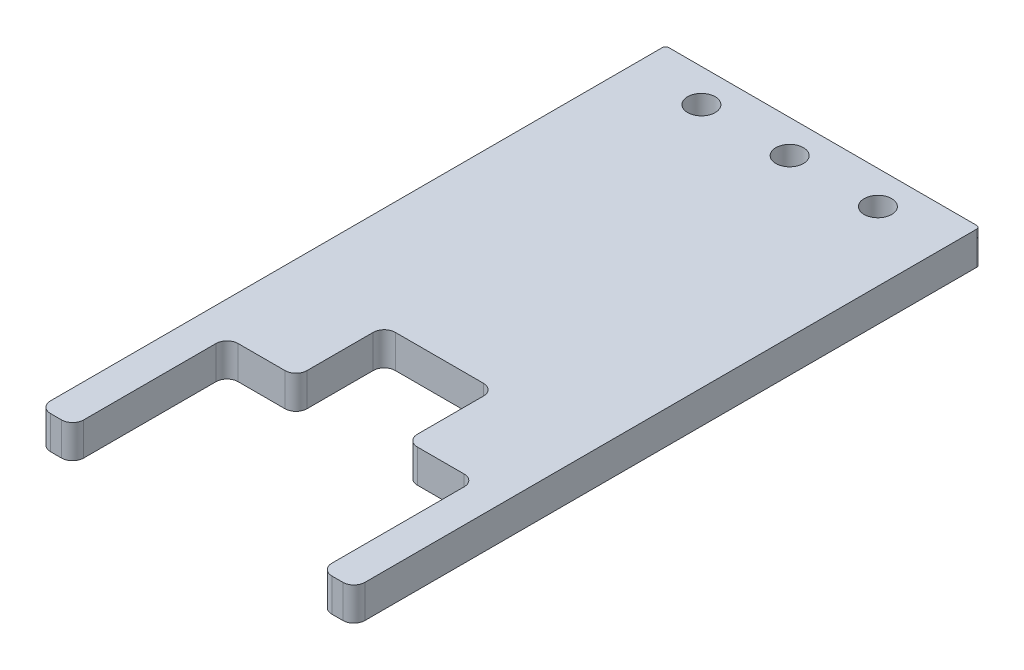
ISO-10303-21;
HEADER;
FILE_DESCRIPTION(('STEP AP214'),'2;1');
FILE_NAME('part.step','',(''),(''),'','','');
FILE_SCHEMA(('AUTOMOTIVE_DESIGN { 1 0 10303 214 1 1 1 1 }'));
ENDSEC;
DATA;
#1=APPLICATION_CONTEXT('core data for automotive mechanical design processes');
#2=APPLICATION_PROTOCOL_DEFINITION('international standard','automotive_design',2000,#1);
#3=PRODUCT_CONTEXT('',#1,'mechanical');
#4=PRODUCT('Part','Part','',(#3));
#5=PRODUCT_RELATED_PRODUCT_CATEGORY('part','',(#4));
#6=PRODUCT_DEFINITION_FORMATION('','',#4);
#7=PRODUCT_DEFINITION_CONTEXT('part definition',#1,'design');
#8=PRODUCT_DEFINITION('design','',#6,#7);
#9=PRODUCT_DEFINITION_SHAPE('','',#8);
#10=(LENGTH_UNIT() NAMED_UNIT(*) SI_UNIT(.MILLI.,.METRE.));
#11=(NAMED_UNIT(*) PLANE_ANGLE_UNIT() SI_UNIT($,.RADIAN.));
#12=(NAMED_UNIT(*) SI_UNIT($,.STERADIAN.) SOLID_ANGLE_UNIT());
#13=UNCERTAINTY_MEASURE_WITH_UNIT(LENGTH_MEASURE(1.E-05),#10,'distance_accuracy_value','');
#14=(GEOMETRIC_REPRESENTATION_CONTEXT(3) GLOBAL_UNCERTAINTY_ASSIGNED_CONTEXT((#13)) GLOBAL_UNIT_ASSIGNED_CONTEXT((#10,
#11,#12)) REPRESENTATION_CONTEXT('',''));
#15=CARTESIAN_POINT('',(0.,0.,0.));
#16=DIRECTION('',(0.,0.,1.));
#17=DIRECTION('',(1.,0.,0.));
#18=AXIS2_PLACEMENT_3D('',#15,#16,#17);
#19=CARTESIAN_POINT('',(0.,3.,0.));
#20=DIRECTION('',(0.,0.,-1.));
#21=DIRECTION('',(-1.,0.,0.));
#22=AXIS2_PLACEMENT_3D('',#19,#20,#21);
#23=PLANE('',#22);
#24=DIRECTION('',(1.,0.,0.));
#25=VECTOR('',#24,1.);
#26=CARTESIAN_POINT('',(0.,3.,0.));
#27=LINE('',#26,#25);
#28=CARTESIAN_POINT('',(20.25,3.,0.));
#29=VERTEX_POINT('',#28);
#30=CARTESIAN_POINT('',(24.5,3.,0.));
#31=VERTEX_POINT('',#30);
#32=EDGE_CURVE('E289',#29,#31,#27,.T.);
#33=ORIENTED_EDGE('',*,*,#32,.F.);
#34=DIRECTION('',(0.,1.,0.));
#35=VECTOR('',#34,1.);
#36=CARTESIAN_POINT('',(20.25,3.,0.));
#37=LINE('',#36,#35);
#38=CARTESIAN_POINT('',(20.25,0.,0.));
#39=VERTEX_POINT('',#38);
#40=EDGE_CURVE('E209',#29,#39,#37,.F.);
#41=ORIENTED_EDGE('',*,*,#40,.T.);
#42=DIRECTION('',(1.,0.,0.));
#43=VECTOR('',#42,1.);
#44=CARTESIAN_POINT('',(0.,0.,0.));
#45=LINE('',#44,#43);
#46=CARTESIAN_POINT('',(24.5,0.,0.));
#47=VERTEX_POINT('',#46);
#48=EDGE_CURVE('E284',#39,#47,#45,.T.);
#49=ORIENTED_EDGE('',*,*,#48,.T.);
#50=DIRECTION('',(0.,1.,0.));
#51=VECTOR('',#50,1.);
#52=CARTESIAN_POINT('',(24.5,3.,0.));
#53=LINE('',#52,#51);
#54=EDGE_CURVE('E213',#47,#31,#53,.T.);
#55=ORIENTED_EDGE('',*,*,#54,.T.);
#56=EDGE_LOOP('',(#33,#41,#49,#55));
#57=FACE_BOUND('',#56,.T.);
#58=ADVANCED_FACE('F40',(#57),#23,.F.);
#59=CARTESIAN_POINT('',(4.,0.,0.));
#60=VERTEX_POINT('',#59);
#61=CARTESIAN_POINT('',(8.25,0.,0.));
#62=VERTEX_POINT('',#61);
#63=EDGE_CURVE('E295',#60,#62,#45,.T.);
#64=ORIENTED_EDGE('',*,*,#63,.T.);
#65=DIRECTION('',(0.,1.,0.));
#66=VECTOR('',#65,1.);
#67=CARTESIAN_POINT('',(8.25,3.,0.));
#68=LINE('',#67,#66);
#69=CARTESIAN_POINT('',(8.25,3.,0.));
#70=VERTEX_POINT('',#69);
#71=EDGE_CURVE('E342',#62,#70,#68,.T.);
#72=ORIENTED_EDGE('',*,*,#71,.T.);
#73=CARTESIAN_POINT('',(4.,3.,0.));
#74=VERTEX_POINT('',#73);
#75=EDGE_CURVE('E285',#74,#70,#27,.T.);
#76=ORIENTED_EDGE('',*,*,#75,.F.);
#77=DIRECTION('',(0.,1.,0.));
#78=VECTOR('',#77,1.);
#79=CARTESIAN_POINT('',(4.,3.,0.));
#80=LINE('',#79,#78);
#81=EDGE_CURVE('E340',#74,#60,#80,.F.);
#82=ORIENTED_EDGE('',*,*,#81,.T.);
#83=EDGE_LOOP('',(#64,#72,#76,#82));
#84=FACE_BOUND('',#83,.T.);
#85=ADVANCED_FACE('F436',(#84),#23,.F.);
#86=CARTESIAN_POINT('',(0.,3.,0.));
#87=DIRECTION('',(0.,1.,0.));
#88=DIRECTION('',(0.,0.,1.));
#89=AXIS2_PLACEMENT_3D('',#86,#87,#88);
#90=PLANE('',#89);
#91=DIRECTION('',(0.,0.,-1.));
#92=VECTOR('',#91,1.);
#93=CARTESIAN_POINT('',(28.5,3.,0.));
#94=LINE('',#93,#92);
#95=CARTESIAN_POINT('',(28.5,3.,13.));
#96=VERTEX_POINT('',#95);
#97=CARTESIAN_POINT('',(28.5,3.,-42.45));
#98=VERTEX_POINT('',#97);
#99=EDGE_CURVE('E288',#96,#98,#94,.T.);
#100=ORIENTED_EDGE('',*,*,#99,.T.);
#101=CARTESIAN_POINT('',(28.2,3.,-42.45));
#102=DIRECTION('',(0.,1.,0.));
#103=DIRECTION('',(0.,0.,1.));
#104=AXIS2_PLACEMENT_3D('',#101,#102,#103);
#105=CIRCLE('',#104,0.3);
#106=CARTESIAN_POINT('',(28.2,3.,-42.75));
#107=VERTEX_POINT('',#106);
#108=EDGE_CURVE('E48',#98,#107,#105,.T.);
#109=ORIENTED_EDGE('',*,*,#108,.T.);
#110=DIRECTION('',(-1.,0.,0.));
#111=VECTOR('',#110,1.);
#112=CARTESIAN_POINT('',(0.,3.,-42.75));
#113=LINE('',#112,#111);
#114=CARTESIAN_POINT('',(0.299999999999999,3.,-42.75));
#115=VERTEX_POINT('',#114);
#116=EDGE_CURVE('E291',#107,#115,#113,.T.);
#117=ORIENTED_EDGE('',*,*,#116,.T.);
#118=CARTESIAN_POINT('',(0.3,3.,-42.45));
#119=DIRECTION('',(0.,1.,0.));
#120=DIRECTION('',(0.,0.,1.));
#121=AXIS2_PLACEMENT_3D('',#118,#119,#120);
#122=CIRCLE('',#121,0.3);
#123=CARTESIAN_POINT('',(0.,3.,-42.45));
#124=VERTEX_POINT('',#123);
#125=EDGE_CURVE('E55',#115,#124,#122,.T.);
#126=ORIENTED_EDGE('',*,*,#125,.T.);
#127=DIRECTION('',(0.,0.,1.));
#128=VECTOR('',#127,1.);
#129=CARTESIAN_POINT('',(0.,3.,-42.75));
#130=LINE('',#129,#128);
#131=CARTESIAN_POINT('',(0.,3.,13.));
#132=VERTEX_POINT('',#131);
#133=EDGE_CURVE('E293',#124,#132,#130,.T.);
#134=ORIENTED_EDGE('',*,*,#133,.T.);
#135=CARTESIAN_POINT('',(1.,3.,13.));
#136=DIRECTION('',(0.,1.,0.));
#137=DIRECTION('',(0.,0.,1.));
#138=AXIS2_PLACEMENT_3D('',#135,#136,#137);
#139=CIRCLE('',#138,1.);
#140=CARTESIAN_POINT('',(1.,3.,14.));
#141=VERTEX_POINT('',#140);
#142=EDGE_CURVE('E311',#132,#141,#139,.T.);
#143=ORIENTED_EDGE('',*,*,#142,.T.);
#144=DIRECTION('',(1.,0.,0.));
#145=VECTOR('',#144,1.);
#146=CARTESIAN_POINT('',(0.,3.,14.));
#147=LINE('',#146,#145);
#148=CARTESIAN_POINT('',(2.,3.,14.));
#149=VERTEX_POINT('',#148);
#150=EDGE_CURVE('E254',#141,#149,#147,.T.);
#151=ORIENTED_EDGE('',*,*,#150,.T.);
#152=CARTESIAN_POINT('',(2.,3.,13.));
#153=DIRECTION('',(0.,1.,0.));
#154=DIRECTION('',(0.,0.,1.));
#155=AXIS2_PLACEMENT_3D('',#152,#153,#154);
#156=CIRCLE('',#155,1.);
#157=CARTESIAN_POINT('',(3.,3.,13.));
#158=VERTEX_POINT('',#157);
#159=EDGE_CURVE('E224',#149,#158,#156,.T.);
#160=ORIENTED_EDGE('',*,*,#159,.T.);
#161=DIRECTION('',(0.,0.,-1.));
#162=VECTOR('',#161,1.);
#163=CARTESIAN_POINT('',(3.,3.,14.));
#164=LINE('',#163,#162);
#165=CARTESIAN_POINT('',(3.,3.,0.999999999999999));
#166=VERTEX_POINT('',#165);
#167=EDGE_CURVE('E259',#158,#166,#164,.T.);
#168=ORIENTED_EDGE('',*,*,#167,.T.);
#169=CARTESIAN_POINT('',(4.,3.,0.999999999999999));
#170=DIRECTION('',(0.,1.,0.));
#171=DIRECTION('',(0.,0.,1.));
#172=AXIS2_PLACEMENT_3D('',#169,#170,#171);
#173=CIRCLE('',#172,1.);
#174=EDGE_CURVE('E381',#166,#74,#173,.F.);
#175=ORIENTED_EDGE('',*,*,#174,.T.);
#176=ORIENTED_EDGE('',*,*,#75,.T.);
#177=CARTESIAN_POINT('',(8.25,3.,-1.));
#178=DIRECTION('',(0.,1.,0.));
#179=DIRECTION('',(0.,0.,1.));
#180=AXIS2_PLACEMENT_3D('',#177,#178,#179);
#181=CIRCLE('',#180,1.);
#182=CARTESIAN_POINT('',(9.25,3.,-1.));
#183=VERTEX_POINT('',#182);
#184=EDGE_CURVE('E214',#70,#183,#181,.T.);
#185=ORIENTED_EDGE('',*,*,#184,.T.);
#186=DIRECTION('',(0.,0.,1.));
#187=VECTOR('',#186,1.);
#188=CARTESIAN_POINT('',(9.25000000000001,3.,0.));
#189=LINE('',#188,#187);
#190=CARTESIAN_POINT('',(9.25,3.,-7.));
#191=VERTEX_POINT('',#190);
#192=EDGE_CURVE('E234',#191,#183,#189,.T.);
#193=ORIENTED_EDGE('',*,*,#192,.F.);
#194=CARTESIAN_POINT('',(10.25,3.,-7.));
#195=DIRECTION('',(0.,1.,0.));
#196=DIRECTION('',(0.,0.,1.));
#197=AXIS2_PLACEMENT_3D('',#194,#195,#196);
#198=CIRCLE('',#197,1.);
#199=CARTESIAN_POINT('',(10.25,3.,-8.));
#200=VERTEX_POINT('',#199);
#201=EDGE_CURVE('E373',#191,#200,#198,.F.);
#202=ORIENTED_EDGE('',*,*,#201,.T.);
#203=DIRECTION('',(-1.,0.,0.));
#204=VECTOR('',#203,1.);
#205=CARTESIAN_POINT('',(9.25,3.,-8.));
#206=LINE('',#205,#204);
#207=CARTESIAN_POINT('',(18.25,3.,-8.));
#208=VERTEX_POINT('',#207);
#209=EDGE_CURVE('E231',#208,#200,#206,.T.);
#210=ORIENTED_EDGE('',*,*,#209,.F.);
#211=CARTESIAN_POINT('',(18.25,3.,-7.));
#212=DIRECTION('',(0.,1.,0.));
#213=DIRECTION('',(0.,0.,1.));
#214=AXIS2_PLACEMENT_3D('',#211,#212,#213);
#215=CIRCLE('',#214,1.);
#216=CARTESIAN_POINT('',(19.25,3.,-7.));
#217=VERTEX_POINT('',#216);
#218=EDGE_CURVE('E230',#208,#217,#215,.F.);
#219=ORIENTED_EDGE('',*,*,#218,.T.);
#220=DIRECTION('',(0.,0.,-1.));
#221=VECTOR('',#220,1.);
#222=CARTESIAN_POINT('',(19.25,3.,0.));
#223=LINE('',#222,#221);
#224=CARTESIAN_POINT('',(19.25,3.,-1.));
#225=VERTEX_POINT('',#224);
#226=EDGE_CURVE('E220',#225,#217,#223,.T.);
#227=ORIENTED_EDGE('',*,*,#226,.F.);
#228=CARTESIAN_POINT('',(20.25,3.,-1.));
#229=DIRECTION('',(0.,1.,0.));
#230=DIRECTION('',(0.,0.,1.));
#231=AXIS2_PLACEMENT_3D('',#228,#229,#230);
#232=CIRCLE('',#231,1.);
#233=EDGE_CURVE('E204',#225,#29,#232,.T.);
#234=ORIENTED_EDGE('',*,*,#233,.T.);
#235=ORIENTED_EDGE('',*,*,#32,.T.);
#236=CARTESIAN_POINT('',(24.5,3.,1.));
#237=DIRECTION('',(0.,1.,0.));
#238=DIRECTION('',(0.,0.,1.));
#239=AXIS2_PLACEMENT_3D('',#236,#237,#238);
#240=CIRCLE('',#239,1.);
#241=CARTESIAN_POINT('',(25.5,3.,0.999999999999999));
#242=VERTEX_POINT('',#241);
#243=EDGE_CURVE('E377',#31,#242,#240,.F.);
#244=ORIENTED_EDGE('',*,*,#243,.T.);
#245=DIRECTION('',(0.,0.,1.));
#246=VECTOR('',#245,1.);
#247=CARTESIAN_POINT('',(25.5,3.,14.));
#248=LINE('',#247,#246);
#249=CARTESIAN_POINT('',(25.5,3.,13.));
#250=VERTEX_POINT('',#249);
#251=EDGE_CURVE('E247',#242,#250,#248,.T.);
#252=ORIENTED_EDGE('',*,*,#251,.T.);
#253=CARTESIAN_POINT('',(26.5,3.,13.));
#254=DIRECTION('',(0.,1.,0.));
#255=DIRECTION('',(0.,0.,1.));
#256=AXIS2_PLACEMENT_3D('',#253,#254,#255);
#257=CIRCLE('',#256,1.);
#258=CARTESIAN_POINT('',(26.5,3.,14.));
#259=VERTEX_POINT('',#258);
#260=EDGE_CURVE('E307',#250,#259,#257,.T.);
#261=ORIENTED_EDGE('',*,*,#260,.T.);
#262=DIRECTION('',(1.,0.,0.));
#263=VECTOR('',#262,1.);
#264=CARTESIAN_POINT('',(28.5,3.,14.));
#265=LINE('',#264,#263);
#266=CARTESIAN_POINT('',(27.5,3.,14.));
#267=VERTEX_POINT('',#266);
#268=EDGE_CURVE('E246',#259,#267,#265,.T.);
#269=ORIENTED_EDGE('',*,*,#268,.T.);
#270=CARTESIAN_POINT('',(27.5,3.,13.));
#271=DIRECTION('',(0.,1.,0.));
#272=DIRECTION('',(0.,0.,1.));
#273=AXIS2_PLACEMENT_3D('',#270,#271,#272);
#274=CIRCLE('',#273,1.);
#275=EDGE_CURVE('E309',#267,#96,#274,.T.);
#276=ORIENTED_EDGE('',*,*,#275,.T.);
#277=EDGE_LOOP('',(#100,#109,#117,#126,#134,#143,#151,#160,#168,#175,#176,#185,#193,#202,#210,
#219,#227,#234,#235,#244,#252,#261,#269,#276));
#278=FACE_BOUND('',#277,.T.);
#279=CARTESIAN_POINT('',(22.25,3.,-39.75));
#280=DIRECTION('',(0.,-1.,0.));
#281=DIRECTION('',(0.,0.,-1.));
#282=AXIS2_PLACEMENT_3D('',#279,#280,#281);
#283=CIRCLE('',#282,1.25);
#284=CARTESIAN_POINT('',(22.25,3.,-41.));
#285=VERTEX_POINT('',#284);
#286=EDGE_CURVE('E269',#285,#285,#283,.T.);
#287=ORIENTED_EDGE('',*,*,#286,.T.);
#288=EDGE_LOOP('',(#287));
#289=FACE_BOUND('',#288,.T.);
#290=CARTESIAN_POINT('',(14.25,3.,-39.75));
#291=DIRECTION('',(0.,-1.,0.));
#292=DIRECTION('',(0.,0.,-1.));
#293=AXIS2_PLACEMENT_3D('',#290,#291,#292);
#294=CIRCLE('',#293,1.25);
#295=CARTESIAN_POINT('',(14.25,3.,-41.));
#296=VERTEX_POINT('',#295);
#297=EDGE_CURVE('E275',#296,#296,#294,.T.);
#298=ORIENTED_EDGE('',*,*,#297,.T.);
#299=EDGE_LOOP('',(#298));
#300=FACE_BOUND('',#299,.T.);
#301=CARTESIAN_POINT('',(6.25,3.,-39.75));
#302=DIRECTION('',(0.,-1.,0.));
#303=DIRECTION('',(0.,0.,-1.));
#304=AXIS2_PLACEMENT_3D('',#301,#302,#303);
#305=CIRCLE('',#304,1.25);
#306=CARTESIAN_POINT('',(6.25,3.,-41.));
#307=VERTEX_POINT('',#306);
#308=EDGE_CURVE('E281',#307,#307,#305,.T.);
#309=ORIENTED_EDGE('',*,*,#308,.T.);
#310=EDGE_LOOP('',(#309));
#311=FACE_BOUND('',#310,.T.);
#312=ADVANCED_FACE('F227',(#278,#289,#300,#311),#90,.T.);
#313=CARTESIAN_POINT('',(0.,0.,0.));
#314=DIRECTION('',(0.,1.,0.));
#315=DIRECTION('',(0.,0.,1.));
#316=AXIS2_PLACEMENT_3D('',#313,#314,#315);
#317=PLANE('',#316);
#318=DIRECTION('',(-1.,0.,0.));
#319=VECTOR('',#318,1.);
#320=CARTESIAN_POINT('',(0.,0.,-42.75));
#321=LINE('',#320,#319);
#322=CARTESIAN_POINT('',(28.2,0.,-42.75));
#323=VERTEX_POINT('',#322);
#324=CARTESIAN_POINT('',(0.299999999999999,0.,-42.75));
#325=VERTEX_POINT('',#324);
#326=EDGE_CURVE('E300',#323,#325,#321,.T.);
#327=ORIENTED_EDGE('',*,*,#326,.F.);
#328=CARTESIAN_POINT('',(28.2,0.,-42.45));
#329=DIRECTION('',(0.,1.,0.));
#330=DIRECTION('',(0.,0.,1.));
#331=AXIS2_PLACEMENT_3D('',#328,#329,#330);
#332=CIRCLE('',#331,0.3);
#333=CARTESIAN_POINT('',(28.5,0.,-42.45));
#334=VERTEX_POINT('',#333);
#335=EDGE_CURVE('E392',#323,#334,#332,.F.);
#336=ORIENTED_EDGE('',*,*,#335,.T.);
#337=DIRECTION('',(0.,0.,-1.));
#338=VECTOR('',#337,1.);
#339=CARTESIAN_POINT('',(28.5,0.,0.));
#340=LINE('',#339,#338);
#341=CARTESIAN_POINT('',(28.5,0.,13.));
#342=VERTEX_POINT('',#341);
#343=EDGE_CURVE('E298',#342,#334,#340,.T.);
#344=ORIENTED_EDGE('',*,*,#343,.F.);
#345=CARTESIAN_POINT('',(27.5,0.,13.));
#346=DIRECTION('',(0.,1.,0.));
#347=DIRECTION('',(0.,0.,1.));
#348=AXIS2_PLACEMENT_3D('',#345,#346,#347);
#349=CIRCLE('',#348,1.);
#350=CARTESIAN_POINT('',(27.5,0.,14.));
#351=VERTEX_POINT('',#350);
#352=EDGE_CURVE('E321',#342,#351,#349,.F.);
#353=ORIENTED_EDGE('',*,*,#352,.T.);
#354=DIRECTION('',(-1.,0.,0.));
#355=VECTOR('',#354,1.);
#356=CARTESIAN_POINT('',(28.5,0.,14.));
#357=LINE('',#356,#355);
#358=CARTESIAN_POINT('',(26.5,0.,14.));
#359=VERTEX_POINT('',#358);
#360=EDGE_CURVE('E245',#351,#359,#357,.T.);
#361=ORIENTED_EDGE('',*,*,#360,.T.);
#362=CARTESIAN_POINT('',(26.5,0.,13.));
#363=DIRECTION('',(0.,1.,0.));
#364=DIRECTION('',(0.,0.,1.));
#365=AXIS2_PLACEMENT_3D('',#362,#363,#364);
#366=CIRCLE('',#365,1.);
#367=CARTESIAN_POINT('',(25.5,0.,13.));
#368=VERTEX_POINT('',#367);
#369=EDGE_CURVE('E319',#359,#368,#366,.F.);
#370=ORIENTED_EDGE('',*,*,#369,.T.);
#371=DIRECTION('',(0.,0.,-1.));
#372=VECTOR('',#371,1.);
#373=CARTESIAN_POINT('',(25.5,0.,14.));
#374=LINE('',#373,#372);
#375=CARTESIAN_POINT('',(25.5,0.,0.999999999999999));
#376=VERTEX_POINT('',#375);
#377=EDGE_CURVE('E242',#368,#376,#374,.T.);
#378=ORIENTED_EDGE('',*,*,#377,.T.);
#379=CARTESIAN_POINT('',(24.5,0.,1.));
#380=DIRECTION('',(0.,1.,0.));
#381=DIRECTION('',(0.,0.,1.));
#382=AXIS2_PLACEMENT_3D('',#379,#380,#381);
#383=CIRCLE('',#382,1.);
#384=EDGE_CURVE('E379',#376,#47,#383,.T.);
#385=ORIENTED_EDGE('',*,*,#384,.T.);
#386=ORIENTED_EDGE('',*,*,#48,.F.);
#387=CARTESIAN_POINT('',(20.25,0.,-1.));
#388=DIRECTION('',(0.,1.,0.));
#389=DIRECTION('',(0.,0.,1.));
#390=AXIS2_PLACEMENT_3D('',#387,#388,#389);
#391=CIRCLE('',#390,1.);
#392=CARTESIAN_POINT('',(19.25,0.,-1.));
#393=VERTEX_POINT('',#392);
#394=EDGE_CURVE('E328',#39,#393,#391,.F.);
#395=ORIENTED_EDGE('',*,*,#394,.T.);
#396=DIRECTION('',(0.,0.,-1.));
#397=VECTOR('',#396,1.);
#398=CARTESIAN_POINT('',(19.25,0.,0.));
#399=LINE('',#398,#397);
#400=CARTESIAN_POINT('',(19.25,0.,-7.));
#401=VERTEX_POINT('',#400);
#402=EDGE_CURVE('E223',#393,#401,#399,.T.);
#403=ORIENTED_EDGE('',*,*,#402,.T.);
#404=CARTESIAN_POINT('',(18.25,0.,-7.));
#405=DIRECTION('',(0.,1.,0.));
#406=DIRECTION('',(0.,0.,1.));
#407=AXIS2_PLACEMENT_3D('',#404,#405,#406);
#408=CIRCLE('',#407,1.);
#409=CARTESIAN_POINT('',(18.25,0.,-8.));
#410=VERTEX_POINT('',#409);
#411=EDGE_CURVE('E371',#401,#410,#408,.T.);
#412=ORIENTED_EDGE('',*,*,#411,.T.);
#413=DIRECTION('',(-1.,0.,0.));
#414=VECTOR('',#413,1.);
#415=CARTESIAN_POINT('',(9.25,0.,-8.));
#416=LINE('',#415,#414);
#417=CARTESIAN_POINT('',(10.25,0.,-8.));
#418=VERTEX_POINT('',#417);
#419=EDGE_CURVE('E523',#410,#418,#416,.T.);
#420=ORIENTED_EDGE('',*,*,#419,.T.);
#421=CARTESIAN_POINT('',(10.25,0.,-7.));
#422=DIRECTION('',(0.,1.,0.));
#423=DIRECTION('',(0.,0.,1.));
#424=AXIS2_PLACEMENT_3D('',#421,#422,#423);
#425=CIRCLE('',#424,1.);
#426=CARTESIAN_POINT('',(9.25,0.,-7.));
#427=VERTEX_POINT('',#426);
#428=EDGE_CURVE('E375',#418,#427,#425,.T.);
#429=ORIENTED_EDGE('',*,*,#428,.T.);
#430=DIRECTION('',(0.,0.,1.));
#431=VECTOR('',#430,1.);
#432=CARTESIAN_POINT('',(9.25000000000001,0.,0.));
#433=LINE('',#432,#431);
#434=CARTESIAN_POINT('',(9.25,0.,-1.));
#435=VERTEX_POINT('',#434);
#436=EDGE_CURVE('E237',#427,#435,#433,.T.);
#437=ORIENTED_EDGE('',*,*,#436,.T.);
#438=CARTESIAN_POINT('',(8.25,0.,-1.));
#439=DIRECTION('',(0.,1.,0.));
#440=DIRECTION('',(0.,0.,1.));
#441=AXIS2_PLACEMENT_3D('',#438,#439,#440);
#442=CIRCLE('',#441,1.);
#443=EDGE_CURVE('E326',#435,#62,#442,.F.);
#444=ORIENTED_EDGE('',*,*,#443,.T.);
#445=ORIENTED_EDGE('',*,*,#63,.F.);
#446=CARTESIAN_POINT('',(4.,0.,0.999999999999999));
#447=DIRECTION('',(0.,1.,0.));
#448=DIRECTION('',(0.,0.,1.));
#449=AXIS2_PLACEMENT_3D('',#446,#447,#448);
#450=CIRCLE('',#449,1.);
#451=CARTESIAN_POINT('',(3.,0.,0.999999999999999));
#452=VERTEX_POINT('',#451);
#453=EDGE_CURVE('E383',#60,#452,#450,.T.);
#454=ORIENTED_EDGE('',*,*,#453,.T.);
#455=DIRECTION('',(0.,0.,1.));
#456=VECTOR('',#455,1.);
#457=CARTESIAN_POINT('',(3.,0.,14.));
#458=LINE('',#457,#456);
#459=CARTESIAN_POINT('',(3.,0.,13.));
#460=VERTEX_POINT('',#459);
#461=EDGE_CURVE('E258',#452,#460,#458,.T.);
#462=ORIENTED_EDGE('',*,*,#461,.T.);
#463=CARTESIAN_POINT('',(2.,0.,13.));
#464=DIRECTION('',(0.,1.,0.));
#465=DIRECTION('',(0.,0.,1.));
#466=AXIS2_PLACEMENT_3D('',#463,#464,#465);
#467=CIRCLE('',#466,1.);
#468=CARTESIAN_POINT('',(2.,0.,14.));
#469=VERTEX_POINT('',#468);
#470=EDGE_CURVE('E317',#460,#469,#467,.F.);
#471=ORIENTED_EDGE('',*,*,#470,.T.);
#472=DIRECTION('',(-1.,0.,0.));
#473=VECTOR('',#472,1.);
#474=CARTESIAN_POINT('',(0.,0.,14.));
#475=LINE('',#474,#473);
#476=CARTESIAN_POINT('',(1.,0.,14.));
#477=VERTEX_POINT('',#476);
#478=EDGE_CURVE('E255',#469,#477,#475,.T.);
#479=ORIENTED_EDGE('',*,*,#478,.T.);
#480=CARTESIAN_POINT('',(1.,0.,13.));
#481=DIRECTION('',(0.,1.,0.));
#482=DIRECTION('',(0.,0.,1.));
#483=AXIS2_PLACEMENT_3D('',#480,#481,#482);
#484=CIRCLE('',#483,1.);
#485=CARTESIAN_POINT('',(0.,0.,13.));
#486=VERTEX_POINT('',#485);
#487=EDGE_CURVE('E323',#477,#486,#484,.F.);
#488=ORIENTED_EDGE('',*,*,#487,.T.);
#489=DIRECTION('',(0.,0.,1.));
#490=VECTOR('',#489,1.);
#491=CARTESIAN_POINT('',(0.,0.,-42.75));
#492=LINE('',#491,#490);
#493=CARTESIAN_POINT('',(0.,0.,-42.45));
#494=VERTEX_POINT('',#493);
#495=EDGE_CURVE('E303',#494,#486,#492,.T.);
#496=ORIENTED_EDGE('',*,*,#495,.F.);
#497=CARTESIAN_POINT('',(0.3,0.,-42.45));
#498=DIRECTION('',(0.,1.,0.));
#499=DIRECTION('',(0.,0.,1.));
#500=AXIS2_PLACEMENT_3D('',#497,#498,#499);
#501=CIRCLE('',#500,0.3);
#502=EDGE_CURVE('E390',#494,#325,#501,.F.);
#503=ORIENTED_EDGE('',*,*,#502,.T.);
#504=EDGE_LOOP('',(#327,#336,#344,#353,#361,#370,#378,#385,#386,#395,#403,#412,#420,#429,#437,
#444,#445,#454,#462,#471,#479,#488,#496,#503));
#505=FACE_BOUND('',#504,.T.);
#506=CARTESIAN_POINT('',(22.25,0.,-39.75));
#507=DIRECTION('',(0.,-1.,0.));
#508=DIRECTION('',(0.,0.,-1.));
#509=AXIS2_PLACEMENT_3D('',#506,#507,#508);
#510=CIRCLE('',#509,1.24999999999999);
#511=CARTESIAN_POINT('',(22.25,0.,-41.));
#512=VERTEX_POINT('',#511);
#513=EDGE_CURVE('E262',#512,#512,#510,.T.);
#514=ORIENTED_EDGE('',*,*,#513,.F.);
#515=EDGE_LOOP('',(#514));
#516=FACE_BOUND('',#515,.T.);
#517=CARTESIAN_POINT('',(14.25,0.,-39.75));
#518=DIRECTION('',(0.,-1.,0.));
#519=DIRECTION('',(0.,0.,-1.));
#520=AXIS2_PLACEMENT_3D('',#517,#518,#519);
#521=CIRCLE('',#520,1.24999999999999);
#522=CARTESIAN_POINT('',(14.25,0.,-41.));
#523=VERTEX_POINT('',#522);
#524=EDGE_CURVE('E272',#523,#523,#521,.T.);
#525=ORIENTED_EDGE('',*,*,#524,.F.);
#526=EDGE_LOOP('',(#525));
#527=FACE_BOUND('',#526,.T.);
#528=CARTESIAN_POINT('',(6.25,0.,-39.75));
#529=DIRECTION('',(0.,-1.,0.));
#530=DIRECTION('',(0.,0.,-1.));
#531=AXIS2_PLACEMENT_3D('',#528,#529,#530);
#532=CIRCLE('',#531,1.24999999999999);
#533=CARTESIAN_POINT('',(6.25,0.,-41.));
#534=VERTEX_POINT('',#533);
#535=EDGE_CURVE('E278',#534,#534,#532,.T.);
#536=ORIENTED_EDGE('',*,*,#535,.F.);
#537=EDGE_LOOP('',(#536));
#538=FACE_BOUND('',#537,.T.);
#539=ADVANCED_FACE('F406',(#505,#516,#527,#538),#317,.F.);
#540=CARTESIAN_POINT('',(28.5,3.,0.));
#541=DIRECTION('',(-1.,0.,0.));
#542=DIRECTION('',(0.,0.,1.));
#543=AXIS2_PLACEMENT_3D('',#540,#541,#542);
#544=PLANE('',#543);
#545=ORIENTED_EDGE('',*,*,#343,.T.);
#546=DIRECTION('',(0.,-1.,0.));
#547=VECTOR('',#546,1.);
#548=CARTESIAN_POINT('',(28.5,3.,-42.45));
#549=LINE('',#548,#547);
#550=EDGE_CURVE('E63',#334,#98,#549,.F.);
#551=ORIENTED_EDGE('',*,*,#550,.T.);
#552=ORIENTED_EDGE('',*,*,#99,.F.);
#553=DIRECTION('',(0.,1.,0.));
#554=VECTOR('',#553,1.);
#555=CARTESIAN_POINT('',(28.5,0.,13.));
#556=LINE('',#555,#554);
#557=EDGE_CURVE('E358',#96,#342,#556,.F.);
#558=ORIENTED_EDGE('',*,*,#557,.T.);
#559=EDGE_LOOP('',(#545,#551,#552,#558));
#560=FACE_BOUND('',#559,.T.);
#561=ADVANCED_FACE('F409',(#560),#544,.F.);
#562=CARTESIAN_POINT('',(0.,3.,-42.75));
#563=DIRECTION('',(0.,0.,1.));
#564=DIRECTION('',(1.,0.,0.));
#565=AXIS2_PLACEMENT_3D('',#562,#563,#564);
#566=PLANE('',#565);
#567=ORIENTED_EDGE('',*,*,#116,.F.);
#568=DIRECTION('',(0.,-1.,0.));
#569=VECTOR('',#568,1.);
#570=CARTESIAN_POINT('',(28.2,3.,-42.75));
#571=LINE('',#570,#569);
#572=EDGE_CURVE('E387',#107,#323,#571,.T.);
#573=ORIENTED_EDGE('',*,*,#572,.T.);
#574=ORIENTED_EDGE('',*,*,#326,.T.);
#575=DIRECTION('',(0.,-1.,0.));
#576=VECTOR('',#575,1.);
#577=CARTESIAN_POINT('',(0.3,3.,-42.75));
#578=LINE('',#577,#576);
#579=EDGE_CURVE('E385',#325,#115,#578,.F.);
#580=ORIENTED_EDGE('',*,*,#579,.T.);
#581=EDGE_LOOP('',(#567,#573,#574,#580));
#582=FACE_BOUND('',#581,.T.);
#583=ADVANCED_FACE('F400',(#582),#566,.F.);
#584=CARTESIAN_POINT('',(0.,3.,-42.75));
#585=DIRECTION('',(1.,0.,0.));
#586=DIRECTION('',(0.,0.,-1.));
#587=AXIS2_PLACEMENT_3D('',#584,#585,#586);
#588=PLANE('',#587);
#589=ORIENTED_EDGE('',*,*,#133,.F.);
#590=DIRECTION('',(0.,-1.,0.));
#591=VECTOR('',#590,1.);
#592=CARTESIAN_POINT('',(0.,3.,-42.45));
#593=LINE('',#592,#591);
#594=EDGE_CURVE('E11',#124,#494,#593,.T.);
#595=ORIENTED_EDGE('',*,*,#594,.T.);
#596=ORIENTED_EDGE('',*,*,#495,.T.);
#597=DIRECTION('',(0.,1.,0.));
#598=VECTOR('',#597,1.);
#599=CARTESIAN_POINT('',(0.,3.,13.));
#600=LINE('',#599,#598);
#601=EDGE_CURVE('E345',#486,#132,#600,.T.);
#602=ORIENTED_EDGE('',*,*,#601,.T.);
#603=EDGE_LOOP('',(#589,#595,#596,#602));
#604=FACE_BOUND('',#603,.T.);
#605=ADVANCED_FACE('F487',(#604),#588,.F.);
#606=CARTESIAN_POINT('',(6.25,0.,-39.75));
#607=DIRECTION('',(0.,-1.,0.));
#608=DIRECTION('',(0.,0.,-1.));
#609=AXIS2_PLACEMENT_3D('',#606,#607,#608);
#610=CYLINDRICAL_SURFACE('',#609,1.24999999999999);
#611=ORIENTED_EDGE('',*,*,#308,.F.);
#612=EDGE_LOOP('',(#611));
#613=FACE_BOUND('',#612,.T.);
#614=ORIENTED_EDGE('',*,*,#535,.T.);
#615=EDGE_LOOP('',(#614));
#616=FACE_BOUND('',#615,.T.);
#617=ADVANCED_FACE('F550',(#613,#616),#610,.F.);
#618=CARTESIAN_POINT('',(14.25,0.,-39.75));
#619=DIRECTION('',(0.,-1.,0.));
#620=DIRECTION('',(0.,0.,-1.));
#621=AXIS2_PLACEMENT_3D('',#618,#619,#620);
#622=CYLINDRICAL_SURFACE('',#621,1.24999999999999);
#623=ORIENTED_EDGE('',*,*,#297,.F.);
#624=EDGE_LOOP('',(#623));
#625=FACE_BOUND('',#624,.T.);
#626=ORIENTED_EDGE('',*,*,#524,.T.);
#627=EDGE_LOOP('',(#626));
#628=FACE_BOUND('',#627,.T.);
#629=ADVANCED_FACE('F546',(#625,#628),#622,.F.);
#630=CARTESIAN_POINT('',(22.25,0.,-39.75));
#631=DIRECTION('',(0.,-1.,0.));
#632=DIRECTION('',(0.,0.,-1.));
#633=AXIS2_PLACEMENT_3D('',#630,#631,#632);
#634=CYLINDRICAL_SURFACE('',#633,1.24999999999999);
#635=ORIENTED_EDGE('',*,*,#286,.F.);
#636=EDGE_LOOP('',(#635));
#637=FACE_BOUND('',#636,.T.);
#638=ORIENTED_EDGE('',*,*,#513,.T.);
#639=EDGE_LOOP('',(#638));
#640=FACE_BOUND('',#639,.T.);
#641=ADVANCED_FACE('F541',(#637,#640),#634,.F.);
#642=CARTESIAN_POINT('',(3.,-14.3178210632764,14.));
#643=DIRECTION('',(1.,0.,0.));
#644=DIRECTION('',(0.,0.,-1.));
#645=AXIS2_PLACEMENT_3D('',#642,#643,#644);
#646=PLANE('',#645);
#647=ORIENTED_EDGE('',*,*,#167,.F.);
#648=DIRECTION('',(0.,1.,0.));
#649=VECTOR('',#648,1.);
#650=CARTESIAN_POINT('',(3.,-14.3178210632764,13.));
#651=LINE('',#650,#649);
#652=EDGE_CURVE('E368',#158,#460,#651,.F.);
#653=ORIENTED_EDGE('',*,*,#652,.T.);
#654=ORIENTED_EDGE('',*,*,#461,.F.);
#655=DIRECTION('',(0.,1.,0.));
#656=VECTOR('',#655,1.);
#657=CARTESIAN_POINT('',(3.,-14.3178210632764,0.999999999999999));
#658=LINE('',#657,#656);
#659=EDGE_CURVE('E365',#452,#166,#658,.T.);
#660=ORIENTED_EDGE('',*,*,#659,.T.);
#661=EDGE_LOOP('',(#647,#653,#654,#660));
#662=FACE_BOUND('',#661,.T.);
#663=ADVANCED_FACE('F501',(#662),#646,.T.);
#664=CARTESIAN_POINT('',(0.,-14.3178210632764,14.));
#665=DIRECTION('',(0.,0.,1.));
#666=DIRECTION('',(1.,0.,0.));
#667=AXIS2_PLACEMENT_3D('',#664,#665,#666);
#668=PLANE('',#667);
#669=ORIENTED_EDGE('',*,*,#150,.F.);
#670=DIRECTION('',(0.,1.,0.));
#671=VECTOR('',#670,1.);
#672=CARTESIAN_POINT('',(1.,0.,14.));
#673=LINE('',#672,#671);
#674=EDGE_CURVE('E351',#141,#477,#673,.F.);
#675=ORIENTED_EDGE('',*,*,#674,.T.);
#676=ORIENTED_EDGE('',*,*,#478,.F.);
#677=DIRECTION('',(0.,1.,0.));
#678=VECTOR('',#677,1.);
#679=CARTESIAN_POINT('',(2.,-14.3178210632764,14.));
#680=LINE('',#679,#678);
#681=EDGE_CURVE('E348',#469,#149,#680,.T.);
#682=ORIENTED_EDGE('',*,*,#681,.T.);
#683=EDGE_LOOP('',(#669,#675,#676,#682));
#684=FACE_BOUND('',#683,.T.);
#685=ADVANCED_FACE('F495',(#684),#668,.T.);
#686=CARTESIAN_POINT('',(25.5,-14.3178210632764,14.));
#687=DIRECTION('',(-1.,0.,0.));
#688=DIRECTION('',(0.,0.,1.));
#689=AXIS2_PLACEMENT_3D('',#686,#687,#688);
#690=PLANE('',#689);
#691=ORIENTED_EDGE('',*,*,#377,.F.);
#692=DIRECTION('',(0.,1.,0.));
#693=VECTOR('',#692,1.);
#694=CARTESIAN_POINT('',(25.5,-14.3178210632764,13.));
#695=LINE('',#694,#693);
#696=EDGE_CURVE('E362',#368,#250,#695,.T.);
#697=ORIENTED_EDGE('',*,*,#696,.T.);
#698=ORIENTED_EDGE('',*,*,#251,.F.);
#699=DIRECTION('',(0.,1.,0.));
#700=VECTOR('',#699,1.);
#701=CARTESIAN_POINT('',(25.5,-14.3178210632764,0.999999999999999));
#702=LINE('',#701,#700);
#703=EDGE_CURVE('E360',#242,#376,#702,.F.);
#704=ORIENTED_EDGE('',*,*,#703,.T.);
#705=EDGE_LOOP('',(#691,#697,#698,#704));
#706=FACE_BOUND('',#705,.T.);
#707=ADVANCED_FACE('F426',(#706),#690,.T.);
#708=CARTESIAN_POINT('',(28.5,-14.3178210632764,14.));
#709=DIRECTION('',(0.,0.,1.));
#710=DIRECTION('',(1.,0.,0.));
#711=AXIS2_PLACEMENT_3D('',#708,#709,#710);
#712=PLANE('',#711);
#713=ORIENTED_EDGE('',*,*,#360,.F.);
#714=DIRECTION('',(0.,1.,0.));
#715=VECTOR('',#714,1.);
#716=CARTESIAN_POINT('',(27.5,3.,14.));
#717=LINE('',#716,#715);
#718=EDGE_CURVE('E355',#351,#267,#717,.T.);
#719=ORIENTED_EDGE('',*,*,#718,.T.);
#720=ORIENTED_EDGE('',*,*,#268,.F.);
#721=DIRECTION('',(0.,1.,0.));
#722=VECTOR('',#721,1.);
#723=CARTESIAN_POINT('',(26.5,-14.3178210632764,14.));
#724=LINE('',#723,#722);
#725=EDGE_CURVE('E353',#259,#359,#724,.F.);
#726=ORIENTED_EDGE('',*,*,#725,.T.);
#727=EDGE_LOOP('',(#713,#719,#720,#726));
#728=FACE_BOUND('',#727,.T.);
#729=ADVANCED_FACE('F417',(#728),#712,.T.);
#730=CARTESIAN_POINT('',(19.25,0.,0.));
#731=DIRECTION('',(1.,0.,0.));
#732=DIRECTION('',(0.,0.,-1.));
#733=AXIS2_PLACEMENT_3D('',#730,#731,#732);
#734=PLANE('',#733);
#735=ORIENTED_EDGE('',*,*,#402,.F.);
#736=DIRECTION('',(0.,1.,0.));
#737=VECTOR('',#736,1.);
#738=CARTESIAN_POINT('',(19.25,0.,-1.));
#739=LINE('',#738,#737);
#740=EDGE_CURVE('E208',#393,#225,#739,.T.);
#741=ORIENTED_EDGE('',*,*,#740,.T.);
#742=ORIENTED_EDGE('',*,*,#226,.T.);
#743=DIRECTION('',(0.,1.,0.));
#744=VECTOR('',#743,1.);
#745=CARTESIAN_POINT('',(19.25,0.,-7.));
#746=LINE('',#745,#744);
#747=EDGE_CURVE('E225',#217,#401,#746,.F.);
#748=ORIENTED_EDGE('',*,*,#747,.T.);
#749=EDGE_LOOP('',(#735,#741,#742,#748));
#750=FACE_BOUND('',#749,.T.);
#751=ADVANCED_FACE('F219',(#750),#734,.F.);
#752=CARTESIAN_POINT('',(9.25000000000001,0.,0.));
#753=DIRECTION('',(-1.,0.,0.));
#754=DIRECTION('',(0.,0.,1.));
#755=AXIS2_PLACEMENT_3D('',#752,#753,#754);
#756=PLANE('',#755);
#757=ORIENTED_EDGE('',*,*,#436,.F.);
#758=DIRECTION('',(0.,1.,0.));
#759=VECTOR('',#758,1.);
#760=CARTESIAN_POINT('',(9.25,3.,-7.));
#761=LINE('',#760,#759);
#762=EDGE_CURVE('E337',#427,#191,#761,.T.);
#763=ORIENTED_EDGE('',*,*,#762,.T.);
#764=ORIENTED_EDGE('',*,*,#192,.T.);
#765=DIRECTION('',(0.,1.,0.));
#766=VECTOR('',#765,1.);
#767=CARTESIAN_POINT('',(9.25,0.,-1.));
#768=LINE('',#767,#766);
#769=EDGE_CURVE('E335',#183,#435,#768,.F.);
#770=ORIENTED_EDGE('',*,*,#769,.T.);
#771=EDGE_LOOP('',(#757,#763,#764,#770));
#772=FACE_BOUND('',#771,.T.);
#773=ADVANCED_FACE('F514',(#772),#756,.F.);
#774=CARTESIAN_POINT('',(9.25,0.,-8.));
#775=DIRECTION('',(0.,0.,-1.));
#776=DIRECTION('',(-1.,0.,0.));
#777=AXIS2_PLACEMENT_3D('',#774,#775,#776);
#778=PLANE('',#777);
#779=ORIENTED_EDGE('',*,*,#419,.F.);
#780=DIRECTION('',(0.,1.,0.));
#781=VECTOR('',#780,1.);
#782=CARTESIAN_POINT('',(18.25,3.,-8.));
#783=LINE('',#782,#781);
#784=EDGE_CURVE('E332',#410,#208,#783,.T.);
#785=ORIENTED_EDGE('',*,*,#784,.T.);
#786=ORIENTED_EDGE('',*,*,#209,.T.);
#787=DIRECTION('',(0.,1.,0.));
#788=VECTOR('',#787,1.);
#789=CARTESIAN_POINT('',(10.25,0.,-8.));
#790=LINE('',#789,#788);
#791=EDGE_CURVE('E330',#200,#418,#790,.F.);
#792=ORIENTED_EDGE('',*,*,#791,.T.);
#793=EDGE_LOOP('',(#779,#785,#786,#792));
#794=FACE_BOUND('',#793,.T.);
#795=ADVANCED_FACE('F448',(#794),#778,.F.);
#796=CARTESIAN_POINT('',(20.25,0.,-1.));
#797=DIRECTION('',(0.,1.,0.));
#798=DIRECTION('',(0.,0.,1.));
#799=AXIS2_PLACEMENT_3D('',#796,#797,#798);
#800=CYLINDRICAL_SURFACE('',#799,1.);
#801=ORIENTED_EDGE('',*,*,#394,.F.);
#802=ORIENTED_EDGE('',*,*,#40,.F.);
#803=ORIENTED_EDGE('',*,*,#233,.F.);
#804=ORIENTED_EDGE('',*,*,#740,.F.);
#805=EDGE_LOOP('',(#801,#802,#803,#804));
#806=FACE_BOUND('',#805,.T.);
#807=ADVANCED_FACE('F207',(#806),#800,.T.);
#808=CARTESIAN_POINT('',(18.25,0.,-7.));
#809=DIRECTION('',(0.,-1.,0.));
#810=DIRECTION('',(0.,0.,-1.));
#811=AXIS2_PLACEMENT_3D('',#808,#809,#810);
#812=CYLINDRICAL_SURFACE('',#811,1.);
#813=ORIENTED_EDGE('',*,*,#411,.F.);
#814=ORIENTED_EDGE('',*,*,#747,.F.);
#815=ORIENTED_EDGE('',*,*,#218,.F.);
#816=ORIENTED_EDGE('',*,*,#784,.F.);
#817=EDGE_LOOP('',(#813,#814,#815,#816));
#818=FACE_BOUND('',#817,.T.);
#819=ADVANCED_FACE('F447',(#818),#812,.F.);
#820=CARTESIAN_POINT('',(10.25,0.,-7.));
#821=DIRECTION('',(0.,-1.,0.));
#822=DIRECTION('',(0.,0.,-1.));
#823=AXIS2_PLACEMENT_3D('',#820,#821,#822);
#824=CYLINDRICAL_SURFACE('',#823,1.);
#825=ORIENTED_EDGE('',*,*,#428,.F.);
#826=ORIENTED_EDGE('',*,*,#791,.F.);
#827=ORIENTED_EDGE('',*,*,#201,.F.);
#828=ORIENTED_EDGE('',*,*,#762,.F.);
#829=EDGE_LOOP('',(#825,#826,#827,#828));
#830=FACE_BOUND('',#829,.T.);
#831=ADVANCED_FACE('F451',(#830),#824,.F.);
#832=CARTESIAN_POINT('',(8.25,3.,-1.));
#833=DIRECTION('',(0.,1.,0.));
#834=DIRECTION('',(0.,0.,1.));
#835=AXIS2_PLACEMENT_3D('',#832,#833,#834);
#836=CYLINDRICAL_SURFACE('',#835,1.);
#837=ORIENTED_EDGE('',*,*,#443,.F.);
#838=ORIENTED_EDGE('',*,*,#769,.F.);
#839=ORIENTED_EDGE('',*,*,#184,.F.);
#840=ORIENTED_EDGE('',*,*,#71,.F.);
#841=EDGE_LOOP('',(#837,#838,#839,#840));
#842=FACE_BOUND('',#841,.T.);
#843=ADVANCED_FACE('F455',(#842),#836,.T.);
#844=CARTESIAN_POINT('',(1.,3.,13.));
#845=DIRECTION('',(0.,-1.,0.));
#846=DIRECTION('',(0.,0.,-1.));
#847=AXIS2_PLACEMENT_3D('',#844,#845,#846);
#848=CYLINDRICAL_SURFACE('',#847,1.);
#849=ORIENTED_EDGE('',*,*,#487,.F.);
#850=ORIENTED_EDGE('',*,*,#674,.F.);
#851=ORIENTED_EDGE('',*,*,#142,.F.);
#852=ORIENTED_EDGE('',*,*,#601,.F.);
#853=EDGE_LOOP('',(#849,#850,#851,#852));
#854=FACE_BOUND('',#853,.T.);
#855=ADVANCED_FACE('F459',(#854),#848,.T.);
#856=CARTESIAN_POINT('',(27.5,-14.3178210632764,13.));
#857=DIRECTION('',(0.,-1.,0.));
#858=DIRECTION('',(0.,0.,-1.));
#859=AXIS2_PLACEMENT_3D('',#856,#857,#858);
#860=CYLINDRICAL_SURFACE('',#859,1.);
#861=ORIENTED_EDGE('',*,*,#352,.F.);
#862=ORIENTED_EDGE('',*,*,#557,.F.);
#863=ORIENTED_EDGE('',*,*,#275,.F.);
#864=ORIENTED_EDGE('',*,*,#718,.F.);
#865=EDGE_LOOP('',(#861,#862,#863,#864));
#866=FACE_BOUND('',#865,.T.);
#867=ADVANCED_FACE('F412',(#866),#860,.T.);
#868=CARTESIAN_POINT('',(26.5,-14.3178210632764,13.));
#869=DIRECTION('',(0.,1.,0.));
#870=DIRECTION('',(0.,0.,1.));
#871=AXIS2_PLACEMENT_3D('',#868,#869,#870);
#872=CYLINDRICAL_SURFACE('',#871,1.);
#873=ORIENTED_EDGE('',*,*,#369,.F.);
#874=ORIENTED_EDGE('',*,*,#725,.F.);
#875=ORIENTED_EDGE('',*,*,#260,.F.);
#876=ORIENTED_EDGE('',*,*,#696,.F.);
#877=EDGE_LOOP('',(#873,#874,#875,#876));
#878=FACE_BOUND('',#877,.T.);
#879=ADVANCED_FACE('F421',(#878),#872,.T.);
#880=CARTESIAN_POINT('',(2.,-14.3178210632764,13.));
#881=DIRECTION('',(0.,1.,0.));
#882=DIRECTION('',(0.,0.,1.));
#883=AXIS2_PLACEMENT_3D('',#880,#881,#882);
#884=CYLINDRICAL_SURFACE('',#883,1.);
#885=ORIENTED_EDGE('',*,*,#470,.F.);
#886=ORIENTED_EDGE('',*,*,#652,.F.);
#887=ORIENTED_EDGE('',*,*,#159,.F.);
#888=ORIENTED_EDGE('',*,*,#681,.F.);
#889=EDGE_LOOP('',(#885,#886,#887,#888));
#890=FACE_BOUND('',#889,.T.);
#891=ADVANCED_FACE('F468',(#890),#884,.T.);
#892=CARTESIAN_POINT('',(24.5,3.,1.));
#893=DIRECTION('',(0.,1.,0.));
#894=DIRECTION('',(0.,0.,1.));
#895=AXIS2_PLACEMENT_3D('',#892,#893,#894);
#896=CYLINDRICAL_SURFACE('',#895,1.);
#897=ORIENTED_EDGE('',*,*,#384,.F.);
#898=ORIENTED_EDGE('',*,*,#703,.F.);
#899=ORIENTED_EDGE('',*,*,#243,.F.);
#900=ORIENTED_EDGE('',*,*,#54,.F.);
#901=EDGE_LOOP('',(#897,#898,#899,#900));
#902=FACE_BOUND('',#901,.T.);
#903=ADVANCED_FACE('F430',(#902),#896,.F.);
#904=CARTESIAN_POINT('',(4.,-14.3178210632764,0.999999999999999));
#905=DIRECTION('',(0.,1.,0.));
#906=DIRECTION('',(0.,0.,1.));
#907=AXIS2_PLACEMENT_3D('',#904,#905,#906);
#908=CYLINDRICAL_SURFACE('',#907,1.);
#909=ORIENTED_EDGE('',*,*,#453,.F.);
#910=ORIENTED_EDGE('',*,*,#81,.F.);
#911=ORIENTED_EDGE('',*,*,#174,.F.);
#912=ORIENTED_EDGE('',*,*,#659,.F.);
#913=EDGE_LOOP('',(#909,#910,#911,#912));
#914=FACE_BOUND('',#913,.T.);
#915=ADVANCED_FACE('F474',(#914),#908,.F.);
#916=CARTESIAN_POINT('',(28.2,3.,-42.45));
#917=DIRECTION('',(0.,-1.,0.));
#918=DIRECTION('',(0.,0.,-1.));
#919=AXIS2_PLACEMENT_3D('',#916,#917,#918);
#920=CYLINDRICAL_SURFACE('',#919,0.3);
#921=ORIENTED_EDGE('',*,*,#108,.F.);
#922=ORIENTED_EDGE('',*,*,#550,.F.);
#923=ORIENTED_EDGE('',*,*,#335,.F.);
#924=ORIENTED_EDGE('',*,*,#572,.F.);
#925=EDGE_LOOP('',(#921,#922,#923,#924));
#926=FACE_BOUND('',#925,.T.);
#927=ADVANCED_FACE('F403',(#926),#920,.T.);
#928=CARTESIAN_POINT('',(0.3,3.,-42.45));
#929=DIRECTION('',(0.,-1.,0.));
#930=DIRECTION('',(0.,0.,-1.));
#931=AXIS2_PLACEMENT_3D('',#928,#929,#930);
#932=CYLINDRICAL_SURFACE('',#931,0.3);
#933=ORIENTED_EDGE('',*,*,#125,.F.);
#934=ORIENTED_EDGE('',*,*,#579,.F.);
#935=ORIENTED_EDGE('',*,*,#502,.F.);
#936=ORIENTED_EDGE('',*,*,#594,.F.);
#937=EDGE_LOOP('',(#933,#934,#935,#936));
#938=FACE_BOUND('',#937,.T.);
#939=ADVANCED_FACE('F42',(#938),#932,.T.);
#940=CLOSED_SHELL('',(#58,#85,#312,#539,#561,#583,#605,#617,#629,#641,#663,#685,#707,#729,#751,
#773,#795,#807,#819,#831,#843,#855,#867,#879,#891,#903,#915,#927,#939));
#941=MANIFOLD_SOLID_BREP('B2',#940);
#942=ADVANCED_BREP_SHAPE_REPRESENTATION('',(#18,#941),#14);
#943=SHAPE_DEFINITION_REPRESENTATION(#9,#942);
ENDSEC;
END-ISO-10303-21;
